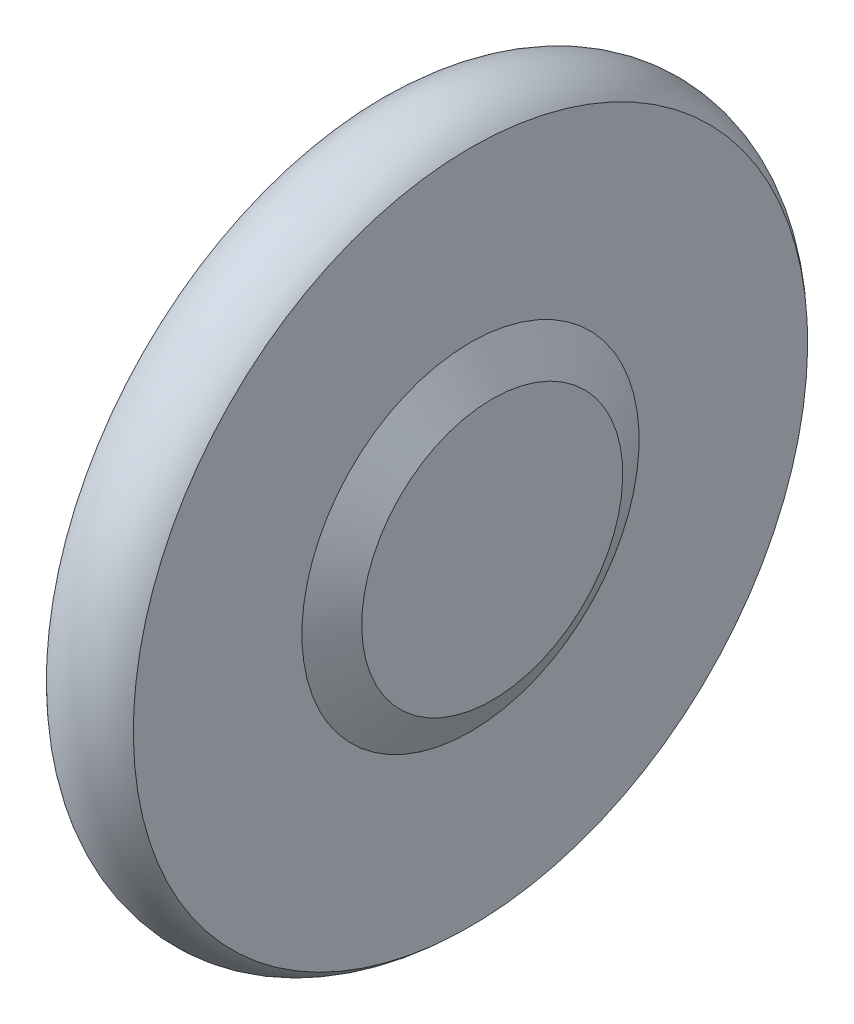
ISO-10303-21;
HEADER;
FILE_DESCRIPTION(('STEP AP214'),'2;1');
FILE_NAME('part.step','',(''),(''),'','','');
FILE_SCHEMA(('AUTOMOTIVE_DESIGN { 1 0 10303 214 1 1 1 1 }'));
ENDSEC;
DATA;
#1=APPLICATION_CONTEXT('core data for automotive mechanical design processes');
#2=APPLICATION_PROTOCOL_DEFINITION('international standard','automotive_design',2000,#1);
#3=PRODUCT_CONTEXT('',#1,'mechanical');
#4=PRODUCT('Part','Part','',(#3));
#5=PRODUCT_RELATED_PRODUCT_CATEGORY('part','',(#4));
#6=PRODUCT_DEFINITION_FORMATION('','',#4);
#7=PRODUCT_DEFINITION_CONTEXT('part definition',#1,'design');
#8=PRODUCT_DEFINITION('design','',#6,#7);
#9=PRODUCT_DEFINITION_SHAPE('','',#8);
#10=(LENGTH_UNIT() NAMED_UNIT(*) SI_UNIT(.MILLI.,.METRE.));
#11=(NAMED_UNIT(*) PLANE_ANGLE_UNIT() SI_UNIT($,.RADIAN.));
#12=(NAMED_UNIT(*) SI_UNIT($,.STERADIAN.) SOLID_ANGLE_UNIT());
#13=UNCERTAINTY_MEASURE_WITH_UNIT(LENGTH_MEASURE(1.E-05),#10,'distance_accuracy_value','');
#14=(GEOMETRIC_REPRESENTATION_CONTEXT(3) GLOBAL_UNCERTAINTY_ASSIGNED_CONTEXT((#13)) GLOBAL_UNIT_ASSIGNED_CONTEXT((#10,
#11,#12)) REPRESENTATION_CONTEXT('',''));
#15=CARTESIAN_POINT('',(0.,0.,0.));
#16=DIRECTION('',(0.,0.,1.));
#17=DIRECTION('',(1.,0.,0.));
#18=AXIS2_PLACEMENT_3D('',#15,#16,#17);
#19=CARTESIAN_POINT('',(30.,0.,0.));
#20=DIRECTION('',(1.,0.,0.));
#21=DIRECTION('',(0.,1.,0.));
#22=AXIS2_PLACEMENT_3D('',#19,#20,#21);
#23=PLANE('',#22);
#24=CARTESIAN_POINT('',(30.,0.,0.));
#25=DIRECTION('',(1.,0.,0.));
#26=DIRECTION('',(0.,1.,0.));
#27=AXIS2_PLACEMENT_3D('',#24,#25,#26);
#28=CIRCLE('',#27,60.);
#29=CARTESIAN_POINT('',(30.,60.,0.));
#30=VERTEX_POINT('',#29);
#31=EDGE_CURVE('E61',#30,#30,#28,.T.);
#32=ORIENTED_EDGE('',*,*,#31,.T.);
#33=EDGE_LOOP('',(#32));
#34=FACE_BOUND('',#33,.T.);
#35=ADVANCED_FACE('F33',(#34),#23,.T.);
#36=CARTESIAN_POINT('',(-50.,0.,0.));
#37=DIRECTION('',(-1.,0.,0.));
#38=DIRECTION('',(0.,-1.,0.));
#39=AXIS2_PLACEMENT_3D('',#36,#37,#38);
#40=PLANE('',#39);
#41=CARTESIAN_POINT('',(-50.,0.,0.));
#42=DIRECTION('',(1.,0.,0.));
#43=DIRECTION('',(0.,1.,0.));
#44=AXIS2_PLACEMENT_3D('',#41,#42,#43);
#45=CIRCLE('',#44,8.00000000000001);
#46=CARTESIAN_POINT('',(-50.,8.,0.));
#47=VERTEX_POINT('',#46);
#48=EDGE_CURVE('E10',#47,#47,#45,.T.);
#49=ORIENTED_EDGE('',*,*,#48,.F.);
#50=EDGE_LOOP('',(#49));
#51=FACE_BOUND('',#50,.T.);
#52=ADVANCED_FACE('F78',(#51),#40,.T.);
#53=CARTESIAN_POINT('',(0.,0.,0.));
#54=DIRECTION('',(1.,0.,0.));
#55=DIRECTION('',(0.,1.,0.));
#56=AXIS2_PLACEMENT_3D('',#53,#54,#55);
#57=CYLINDRICAL_SURFACE('',#56,8.);
#58=ORIENTED_EDGE('',*,*,#48,.T.);
#59=EDGE_LOOP('',(#58));
#60=FACE_BOUND('',#59,.T.);
#61=CARTESIAN_POINT('',(-30.,0.,0.));
#62=DIRECTION('',(1.,0.,0.));
#63=DIRECTION('',(0.,1.,0.));
#64=AXIS2_PLACEMENT_3D('',#61,#62,#63);
#65=CIRCLE('',#64,8.);
#66=CARTESIAN_POINT('',(-30.,8.,0.));
#67=VERTEX_POINT('',#66);
#68=EDGE_CURVE('E39',#67,#67,#65,.T.);
#69=ORIENTED_EDGE('',*,*,#68,.F.);
#70=EDGE_LOOP('',(#69));
#71=FACE_BOUND('',#70,.T.);
#72=ADVANCED_FACE('F82',(#60,#71),#57,.T.);
#73=CARTESIAN_POINT('',(-30.,8.,0.));
#74=DIRECTION('',(-1.,0.,0.));
#75=DIRECTION('',(0.,-1.,0.));
#76=AXIS2_PLACEMENT_3D('',#73,#74,#75);
#77=PLANE('',#76);
#78=ORIENTED_EDGE('',*,*,#68,.T.);
#79=EDGE_LOOP('',(#78));
#80=FACE_BOUND('',#79,.T.);
#81=CARTESIAN_POINT('',(-30.,0.,0.));
#82=DIRECTION('',(1.,0.,0.));
#83=DIRECTION('',(0.,1.,0.));
#84=AXIS2_PLACEMENT_3D('',#81,#82,#83);
#85=CIRCLE('',#84,60.);
#86=CARTESIAN_POINT('',(-30.,60.,0.));
#87=VERTEX_POINT('',#86);
#88=EDGE_CURVE('E43',#87,#87,#85,.T.);
#89=ORIENTED_EDGE('',*,*,#88,.F.);
#90=EDGE_LOOP('',(#89));
#91=FACE_BOUND('',#90,.T.);
#92=ADVANCED_FACE('F87',(#80,#91),#77,.T.);
#93=CARTESIAN_POINT('',(-20.,0.,0.));
#94=DIRECTION('',(1.,0.,0.));
#95=DIRECTION('',(0.,1.,0.));
#96=AXIS2_PLACEMENT_3D('',#93,#94,#95);
#97=CONICAL_SURFACE('',#96,77.5,1.05165021254837);
#98=ORIENTED_EDGE('',*,*,#88,.T.);
#99=EDGE_LOOP('',(#98));
#100=FACE_BOUND('',#99,.T.);
#101=CARTESIAN_POINT('',(-20.,0.,0.));
#102=DIRECTION('',(1.,0.,0.));
#103=DIRECTION('',(0.,1.,0.));
#104=AXIS2_PLACEMENT_3D('',#101,#102,#103);
#105=CIRCLE('',#104,77.5);
#106=CARTESIAN_POINT('',(-20.,77.5,0.));
#107=VERTEX_POINT('',#106);
#108=EDGE_CURVE('E47',#107,#107,#105,.T.);
#109=ORIENTED_EDGE('',*,*,#108,.F.);
#110=EDGE_LOOP('',(#109));
#111=FACE_BOUND('',#110,.T.);
#112=ADVANCED_FACE('F92',(#100,#111),#97,.T.);
#113=CARTESIAN_POINT('',(-20.,77.5,0.));
#114=DIRECTION('',(-1.,0.,0.));
#115=DIRECTION('',(0.,-1.,0.));
#116=AXIS2_PLACEMENT_3D('',#113,#114,#115);
#117=PLANE('',#116);
#118=ORIENTED_EDGE('',*,*,#108,.T.);
#119=EDGE_LOOP('',(#118));
#120=FACE_BOUND('',#119,.T.);
#121=CARTESIAN_POINT('',(-20.,0.,0.));
#122=DIRECTION('',(1.,0.,0.));
#123=DIRECTION('',(0.,1.,0.));
#124=AXIS2_PLACEMENT_3D('',#121,#122,#123);
#125=CIRCLE('',#124,155.);
#126=CARTESIAN_POINT('',(-20.,155.,0.));
#127=VERTEX_POINT('',#126);
#128=EDGE_CURVE('E52',#127,#127,#125,.T.);
#129=ORIENTED_EDGE('',*,*,#128,.F.);
#130=EDGE_LOOP('',(#129));
#131=FACE_BOUND('',#130,.T.);
#132=ADVANCED_FACE('F95',(#120,#131),#117,.T.);
#133=CARTESIAN_POINT('',(0.,0.,0.));
#134=DIRECTION('',(1.,0.,0.));
#135=DIRECTION('',(0.,1.,0.));
#136=AXIS2_PLACEMENT_3D('',#133,#134,#135);
#137=TOROIDAL_SURFACE('',#136,135.,28.2842712474619);
#138=ORIENTED_EDGE('',*,*,#128,.T.);
#139=EDGE_LOOP('',(#138));
#140=FACE_BOUND('',#139,.T.);
#141=CARTESIAN_POINT('',(20.,0.,0.));
#142=DIRECTION('',(1.,0.,0.));
#143=DIRECTION('',(0.,1.,0.));
#144=AXIS2_PLACEMENT_3D('',#141,#142,#143);
#145=CIRCLE('',#144,155.);
#146=CARTESIAN_POINT('',(20.,155.,0.));
#147=VERTEX_POINT('',#146);
#148=EDGE_CURVE('E55',#147,#147,#145,.T.);
#149=ORIENTED_EDGE('',*,*,#148,.F.);
#150=EDGE_LOOP('',(#149));
#151=FACE_BOUND('',#150,.T.);
#152=ADVANCED_FACE('F74',(#140,#151),#137,.T.);
#153=CARTESIAN_POINT('',(20.,77.5,0.));
#154=DIRECTION('',(1.,0.,0.));
#155=DIRECTION('',(0.,1.,0.));
#156=AXIS2_PLACEMENT_3D('',#153,#154,#155);
#157=PLANE('',#156);
#158=ORIENTED_EDGE('',*,*,#148,.T.);
#159=EDGE_LOOP('',(#158));
#160=FACE_BOUND('',#159,.T.);
#161=CARTESIAN_POINT('',(20.,0.,0.));
#162=DIRECTION('',(1.,0.,0.));
#163=DIRECTION('',(0.,1.,0.));
#164=AXIS2_PLACEMENT_3D('',#161,#162,#163);
#165=CIRCLE('',#164,77.5);
#166=CARTESIAN_POINT('',(20.,77.5,0.));
#167=VERTEX_POINT('',#166);
#168=EDGE_CURVE('E58',#167,#167,#165,.T.);
#169=ORIENTED_EDGE('',*,*,#168,.F.);
#170=EDGE_LOOP('',(#169));
#171=FACE_BOUND('',#170,.T.);
#172=ADVANCED_FACE('F68',(#160,#171),#157,.T.);
#173=CARTESIAN_POINT('',(30.,0.,0.));
#174=DIRECTION('',(-1.,0.,0.));
#175=DIRECTION('',(0.,-1.,0.));
#176=AXIS2_PLACEMENT_3D('',#173,#174,#175);
#177=CONICAL_SURFACE('',#176,60.,1.05165021254837);
#178=ORIENTED_EDGE('',*,*,#168,.T.);
#179=EDGE_LOOP('',(#178));
#180=FACE_BOUND('',#179,.T.);
#181=ORIENTED_EDGE('',*,*,#31,.F.);
#182=EDGE_LOOP('',(#181));
#183=FACE_BOUND('',#182,.T.);
#184=ADVANCED_FACE('F66',(#180,#183),#177,.T.);
#185=CLOSED_SHELL('',(#35,#52,#72,#92,#112,#132,#152,#172,#184));
#186=MANIFOLD_SOLID_BREP('B2',#185);
#187=ADVANCED_BREP_SHAPE_REPRESENTATION('',(#18,#186),#14);
#188=SHAPE_DEFINITION_REPRESENTATION(#9,#187);
ENDSEC;
END-ISO-10303-21;
